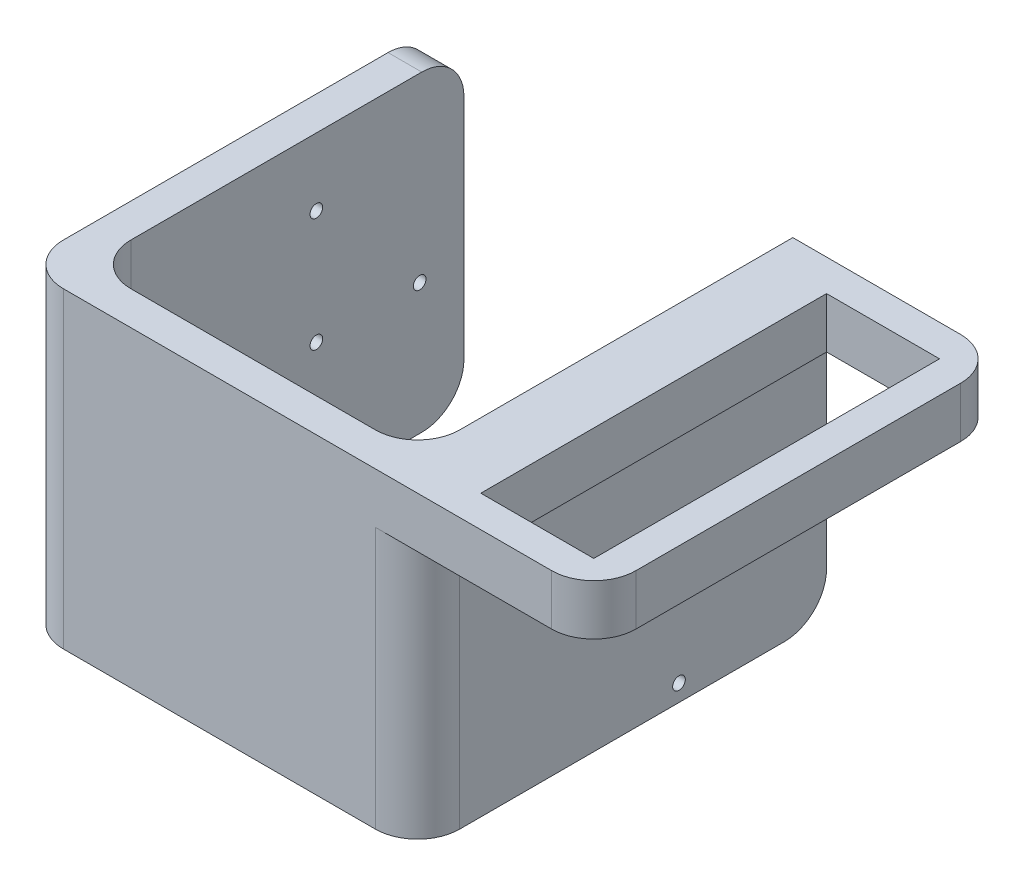
ISO-10303-21;
HEADER;
FILE_DESCRIPTION(('STEP AP214'),'2;1');
FILE_NAME('part.step','',(''),(''),'','','');
FILE_SCHEMA(('AUTOMOTIVE_DESIGN { 1 0 10303 214 1 1 1 1 }'));
ENDSEC;
DATA;
#1=APPLICATION_CONTEXT('core data for automotive mechanical design processes');
#2=APPLICATION_PROTOCOL_DEFINITION('international standard','automotive_design',2000,#1);
#3=PRODUCT_CONTEXT('',#1,'mechanical');
#4=PRODUCT('Part','Part','',(#3));
#5=PRODUCT_RELATED_PRODUCT_CATEGORY('part','',(#4));
#6=PRODUCT_DEFINITION_FORMATION('','',#4);
#7=PRODUCT_DEFINITION_CONTEXT('part definition',#1,'design');
#8=PRODUCT_DEFINITION('design','',#6,#7);
#9=PRODUCT_DEFINITION_SHAPE('','',#8);
#10=(LENGTH_UNIT() NAMED_UNIT(*) SI_UNIT(.MILLI.,.METRE.));
#11=(NAMED_UNIT(*) PLANE_ANGLE_UNIT() SI_UNIT($,.RADIAN.));
#12=(NAMED_UNIT(*) SI_UNIT($,.STERADIAN.) SOLID_ANGLE_UNIT());
#13=UNCERTAINTY_MEASURE_WITH_UNIT(LENGTH_MEASURE(1.E-05),#10,'distance_accuracy_value','');
#14=(GEOMETRIC_REPRESENTATION_CONTEXT(3) GLOBAL_UNCERTAINTY_ASSIGNED_CONTEXT((#13)) GLOBAL_UNIT_ASSIGNED_CONTEXT((#10,
#11,#12)) REPRESENTATION_CONTEXT('',''));
#15=CARTESIAN_POINT('',(0.,0.,0.));
#16=DIRECTION('',(0.,0.,1.));
#17=DIRECTION('',(1.,0.,0.));
#18=AXIS2_PLACEMENT_3D('',#15,#16,#17);
#19=CARTESIAN_POINT('',(47.,37.,8.));
#20=DIRECTION('',(-1.,0.,0.));
#21=DIRECTION('',(0.,-1.,0.));
#22=AXIS2_PLACEMENT_3D('',#19,#20,#21);
#23=PLANE('',#22);
#24=CARTESIAN_POINT('',(47.,-6.,-54.));
#25=DIRECTION('',(1.,0.,0.));
#26=DIRECTION('',(0.,1.,0.));
#27=AXIS2_PLACEMENT_3D('',#24,#25,#26);
#28=CIRCLE('',#27,1.5);
#29=CARTESIAN_POINT('',(47.,-4.5,-54.));
#30=VERTEX_POINT('',#29);
#31=EDGE_CURVE('E358',#30,#30,#28,.T.);
#32=ORIENTED_EDGE('',*,*,#31,.F.);
#33=EDGE_LOOP('',(#32));
#34=FACE_BOUND('',#33,.T.);
#35=CARTESIAN_POINT('',(47.,-33.,-54.));
#36=DIRECTION('',(1.,0.,0.));
#37=DIRECTION('',(0.,1.,0.));
#38=AXIS2_PLACEMENT_3D('',#35,#36,#37);
#39=CIRCLE('',#38,1.5);
#40=CARTESIAN_POINT('',(47.,-31.5,-54.));
#41=VERTEX_POINT('',#40);
#42=EDGE_CURVE('E354',#41,#41,#39,.T.);
#43=ORIENTED_EDGE('',*,*,#42,.F.);
#44=EDGE_LOOP('',(#43));
#45=FACE_BOUND('',#44,.T.);
#46=CARTESIAN_POINT('',(47.,-6.,-78.5));
#47=DIRECTION('',(1.,0.,0.));
#48=DIRECTION('',(0.,1.,0.));
#49=AXIS2_PLACEMENT_3D('',#46,#47,#48);
#50=CIRCLE('',#49,1.5);
#51=CARTESIAN_POINT('',(47.,-4.50000000000001,-78.5));
#52=VERTEX_POINT('',#51);
#53=EDGE_CURVE('E350',#52,#52,#50,.T.);
#54=ORIENTED_EDGE('',*,*,#53,.F.);
#55=EDGE_LOOP('',(#54));
#56=FACE_BOUND('',#55,.T.);
#57=CARTESIAN_POINT('',(47.,-6.,-29.5));
#58=DIRECTION('',(1.,0.,0.));
#59=DIRECTION('',(0.,1.,0.));
#60=AXIS2_PLACEMENT_3D('',#57,#58,#59);
#61=CIRCLE('',#60,1.5);
#62=CARTESIAN_POINT('',(47.,-4.5,-29.5));
#63=VERTEX_POINT('',#62);
#64=EDGE_CURVE('E345',#63,#63,#61,.T.);
#65=ORIENTED_EDGE('',*,*,#64,.F.);
#66=EDGE_LOOP('',(#65));
#67=FACE_BOUND('',#66,.T.);
#68=CARTESIAN_POINT('',(47.,21.,-54.));
#69=DIRECTION('',(1.,0.,0.));
#70=DIRECTION('',(0.,1.,0.));
#71=AXIS2_PLACEMENT_3D('',#68,#69,#70);
#72=CIRCLE('',#71,1.5);
#73=CARTESIAN_POINT('',(47.,22.5,-54.));
#74=VERTEX_POINT('',#73);
#75=EDGE_CURVE('E340',#74,#74,#72,.T.);
#76=ORIENTED_EDGE('',*,*,#75,.F.);
#77=EDGE_LOOP('',(#76));
#78=FACE_BOUND('',#77,.T.);
#79=DIRECTION('',(0.,0.,-1.));
#80=VECTOR('',#79,1.);
#81=CARTESIAN_POINT('',(47.,-37.,8.));
#82=LINE('',#81,#80);
#83=CARTESIAN_POINT('',(47.,-37.,-2.));
#84=VERTEX_POINT('',#83);
#85=CARTESIAN_POINT('',(47.,-37.,-79.));
#86=VERTEX_POINT('',#85);
#87=EDGE_CURVE('E450',#84,#86,#82,.T.);
#88=ORIENTED_EDGE('',*,*,#87,.T.);
#89=CARTESIAN_POINT('',(47.,-27.,-79.));
#90=DIRECTION('',(-1.,0.,0.));
#91=DIRECTION('',(0.,-1.,0.));
#92=AXIS2_PLACEMENT_3D('',#89,#90,#91);
#93=CIRCLE('',#92,10.);
#94=CARTESIAN_POINT('',(47.,-27.,-89.));
#95=VERTEX_POINT('',#94);
#96=EDGE_CURVE('E318',#86,#95,#93,.F.);
#97=ORIENTED_EDGE('',*,*,#96,.T.);
#98=DIRECTION('',(0.,-1.,0.));
#99=VECTOR('',#98,1.);
#100=CARTESIAN_POINT('',(47.,37.,-89.));
#101=LINE('',#100,#99);
#102=CARTESIAN_POINT('',(47.,25.,-89.));
#103=VERTEX_POINT('',#102);
#104=EDGE_CURVE('E276',#103,#95,#101,.T.);
#105=ORIENTED_EDGE('',*,*,#104,.F.);
#106=DIRECTION('',(0.,0.,-1.));
#107=VECTOR('',#106,1.);
#108=CARTESIAN_POINT('',(47.,25.,8.));
#109=LINE('',#108,#107);
#110=CARTESIAN_POINT('',(47.,25.,-2.));
#111=VERTEX_POINT('',#110);
#112=EDGE_CURVE('E231',#111,#103,#109,.T.);
#113=ORIENTED_EDGE('',*,*,#112,.F.);
#114=DIRECTION('',(0.,1.,0.));
#115=VECTOR('',#114,1.);
#116=CARTESIAN_POINT('',(47.,-37.,-2.));
#117=LINE('',#116,#115);
#118=EDGE_CURVE('E248',#111,#84,#117,.F.);
#119=ORIENTED_EDGE('',*,*,#118,.T.);
#120=EDGE_LOOP('',(#88,#97,#105,#113,#119));
#121=FACE_BOUND('',#120,.T.);
#122=ADVANCED_FACE('F33',(#34,#45,#56,#67,#78,#121),#23,.F.);
#123=CARTESIAN_POINT('',(0.,0.,0.));
#124=DIRECTION('',(0.,0.,1.));
#125=DIRECTION('',(1.,0.,0.));
#126=AXIS2_PLACEMENT_3D('',#123,#124,#125);
#127=PLANE('',#126);
#128=DIRECTION('',(-1.,0.,0.));
#129=VECTOR('',#128,1.);
#130=CARTESIAN_POINT('',(-47.,37.,0.));
#131=LINE('',#130,#129);
#132=CARTESIAN_POINT('',(29.,37.,0.));
#133=VERTEX_POINT('',#132);
#134=CARTESIAN_POINT('',(-29.,37.,0.));
#135=VERTEX_POINT('',#134);
#136=EDGE_CURVE('E266',#133,#135,#131,.T.);
#137=ORIENTED_EDGE('',*,*,#136,.F.);
#138=DIRECTION('',(0.,1.,0.));
#139=VECTOR('',#138,1.);
#140=CARTESIAN_POINT('',(29.,-37.,0.));
#141=LINE('',#140,#139);
#142=CARTESIAN_POINT('',(29.,-37.,0.));
#143=VERTEX_POINT('',#142);
#144=EDGE_CURVE('E54',#133,#143,#141,.F.);
#145=ORIENTED_EDGE('',*,*,#144,.T.);
#146=DIRECTION('',(1.,0.,0.));
#147=VECTOR('',#146,1.);
#148=CARTESIAN_POINT('',(-47.,-37.,0.));
#149=LINE('',#148,#147);
#150=CARTESIAN_POINT('',(-29.,-37.,0.));
#151=VERTEX_POINT('',#150);
#152=EDGE_CURVE('E440',#151,#143,#149,.T.);
#153=ORIENTED_EDGE('',*,*,#152,.F.);
#154=DIRECTION('',(0.,-1.,0.));
#155=VECTOR('',#154,1.);
#156=CARTESIAN_POINT('',(-29.,37.,0.));
#157=LINE('',#156,#155);
#158=EDGE_CURVE('E439',#151,#135,#157,.F.);
#159=ORIENTED_EDGE('',*,*,#158,.T.);
#160=EDGE_LOOP('',(#137,#145,#153,#159));
#161=FACE_BOUND('',#160,.T.);
#162=ADVANCED_FACE('F407',(#161),#127,.F.);
#163=CARTESIAN_POINT('',(-47.,37.,8.));
#164=DIRECTION('',(0.,-1.,0.));
#165=DIRECTION('',(0.,0.,-1.));
#166=AXIS2_PLACEMENT_3D('',#163,#164,#165);
#167=PLANE('',#166);
#168=DIRECTION('',(1.,0.,0.));
#169=VECTOR('',#168,1.);
#170=CARTESIAN_POINT('',(-47.,37.,-81.5));
#171=LINE('',#170,#169);
#172=CARTESIAN_POINT('',(54.5,37.,-81.5));
#173=VERTEX_POINT('',#172);
#174=CARTESIAN_POINT('',(81.3,37.,-81.5));
#175=VERTEX_POINT('',#174);
#176=EDGE_CURVE('E225',#173,#175,#171,.T.);
#177=ORIENTED_EDGE('',*,*,#176,.T.);
#178=DIRECTION('',(0.,0.,1.));
#179=VECTOR('',#178,1.);
#180=CARTESIAN_POINT('',(81.3,37.,8.00000000000002));
#181=LINE('',#180,#179);
#182=CARTESIAN_POINT('',(81.3,37.,0.500000000000014));
#183=VERTEX_POINT('',#182);
#184=EDGE_CURVE('E228',#175,#183,#181,.T.);
#185=ORIENTED_EDGE('',*,*,#184,.T.);
#186=DIRECTION('',(-1.,0.,0.));
#187=VECTOR('',#186,1.);
#188=CARTESIAN_POINT('',(-47.,37.,0.500000000000014));
#189=LINE('',#188,#187);
#190=CARTESIAN_POINT('',(54.5,37.,0.500000000000014));
#191=VERTEX_POINT('',#190);
#192=EDGE_CURVE('E220',#183,#191,#189,.T.);
#193=ORIENTED_EDGE('',*,*,#192,.T.);
#194=DIRECTION('',(0.,0.,-1.));
#195=VECTOR('',#194,1.);
#196=CARTESIAN_POINT('',(54.5,37.,8.00000000000001));
#197=LINE('',#196,#195);
#198=EDGE_CURVE('E195',#191,#173,#197,.T.);
#199=ORIENTED_EDGE('',*,*,#198,.T.);
#200=EDGE_LOOP('',(#177,#185,#193,#199));
#201=FACE_BOUND('',#200,.T.);
#202=DIRECTION('',(0.,0.,1.));
#203=VECTOR('',#202,1.);
#204=CARTESIAN_POINT('',(88.8,37.,8.));
#205=LINE('',#204,#203);
#206=CARTESIAN_POINT('',(88.8,37.,-79.));
#207=VERTEX_POINT('',#206);
#208=CARTESIAN_POINT('',(88.8,37.,-2.));
#209=VERTEX_POINT('',#208);
#210=EDGE_CURVE('E235',#207,#209,#205,.T.);
#211=ORIENTED_EDGE('',*,*,#210,.F.);
#212=CARTESIAN_POINT('',(78.8,37.,-79.));
#213=DIRECTION('',(0.,-1.,0.));
#214=DIRECTION('',(0.,0.,-1.));
#215=AXIS2_PLACEMENT_3D('',#212,#213,#214);
#216=CIRCLE('',#215,10.);
#217=CARTESIAN_POINT('',(78.8,37.,-89.));
#218=VERTEX_POINT('',#217);
#219=EDGE_CURVE('E412',#207,#218,#216,.F.);
#220=ORIENTED_EDGE('',*,*,#219,.T.);
#221=DIRECTION('',(1.,0.,0.));
#222=VECTOR('',#221,1.);
#223=CARTESIAN_POINT('',(47.,37.,-89.));
#224=LINE('',#223,#222);
#225=CARTESIAN_POINT('',(39.,37.,-89.));
#226=VERTEX_POINT('',#225);
#227=EDGE_CURVE('E323',#226,#218,#224,.T.);
#228=ORIENTED_EDGE('',*,*,#227,.F.);
#229=DIRECTION('',(0.,0.,1.));
#230=VECTOR('',#229,1.);
#231=CARTESIAN_POINT('',(39.,37.,-89.));
#232=LINE('',#231,#230);
#233=CARTESIAN_POINT('',(39.,37.,-9.99999999999999));
#234=VERTEX_POINT('',#233);
#235=EDGE_CURVE('E473',#226,#234,#232,.T.);
#236=ORIENTED_EDGE('',*,*,#235,.T.);
#237=CARTESIAN_POINT('',(29.,37.,-9.99999999999999));
#238=DIRECTION('',(0.,-1.,0.));
#239=DIRECTION('',(0.,0.,-1.));
#240=AXIS2_PLACEMENT_3D('',#237,#238,#239);
#241=CIRCLE('',#240,10.);
#242=EDGE_CURVE('E41',#234,#133,#241,.T.);
#243=ORIENTED_EDGE('',*,*,#242,.T.);
#244=ORIENTED_EDGE('',*,*,#136,.T.);
#245=CARTESIAN_POINT('',(-29.,37.,-9.99999999999999));
#246=DIRECTION('',(0.,-1.,0.));
#247=DIRECTION('',(0.,0.,-1.));
#248=AXIS2_PLACEMENT_3D('',#245,#246,#247);
#249=CIRCLE('',#248,10.);
#250=CARTESIAN_POINT('',(-39.,37.,-9.99999999999999));
#251=VERTEX_POINT('',#250);
#252=EDGE_CURVE('E672',#135,#251,#249,.T.);
#253=ORIENTED_EDGE('',*,*,#252,.T.);
#254=DIRECTION('',(0.,0.,1.));
#255=VECTOR('',#254,1.);
#256=CARTESIAN_POINT('',(-39.,37.,-89.));
#257=LINE('',#256,#255);
#258=CARTESIAN_POINT('',(-39.,37.,-79.));
#259=VERTEX_POINT('',#258);
#260=EDGE_CURVE('E267',#259,#251,#257,.T.);
#261=ORIENTED_EDGE('',*,*,#260,.F.);
#262=DIRECTION('',(1.,0.,0.));
#263=VECTOR('',#262,1.);
#264=CARTESIAN_POINT('',(-47.,37.,-79.));
#265=LINE('',#264,#263);
#266=CARTESIAN_POINT('',(-47.,37.,-79.));
#267=VERTEX_POINT('',#266);
#268=EDGE_CURVE('E287',#259,#267,#265,.F.);
#269=ORIENTED_EDGE('',*,*,#268,.T.);
#270=DIRECTION('',(0.,0.,-1.));
#271=VECTOR('',#270,1.);
#272=CARTESIAN_POINT('',(-47.,37.,8.));
#273=LINE('',#272,#271);
#274=CARTESIAN_POINT('',(-47.,37.,-2.));
#275=VERTEX_POINT('',#274);
#276=EDGE_CURVE('E272',#275,#267,#273,.T.);
#277=ORIENTED_EDGE('',*,*,#276,.F.);
#278=CARTESIAN_POINT('',(-37.,37.,-2.));
#279=DIRECTION('',(0.,-1.,0.));
#280=DIRECTION('',(0.,0.,-1.));
#281=AXIS2_PLACEMENT_3D('',#278,#279,#280);
#282=CIRCLE('',#281,10.);
#283=CARTESIAN_POINT('',(-37.,37.,8.));
#284=VERTEX_POINT('',#283);
#285=EDGE_CURVE('E481',#275,#284,#282,.F.);
#286=ORIENTED_EDGE('',*,*,#285,.T.);
#287=DIRECTION('',(-1.,0.,0.));
#288=VECTOR('',#287,1.);
#289=CARTESIAN_POINT('',(-47.,37.,8.));
#290=LINE('',#289,#288);
#291=CARTESIAN_POINT('',(78.8,37.,8.));
#292=VERTEX_POINT('',#291);
#293=EDGE_CURVE('E443',#292,#284,#290,.T.);
#294=ORIENTED_EDGE('',*,*,#293,.F.);
#295=CARTESIAN_POINT('',(78.8,37.,-2.));
#296=DIRECTION('',(0.,-1.,0.));
#297=DIRECTION('',(0.,0.,-1.));
#298=AXIS2_PLACEMENT_3D('',#295,#296,#297);
#299=CIRCLE('',#298,10.);
#300=EDGE_CURVE('E416',#292,#209,#299,.F.);
#301=ORIENTED_EDGE('',*,*,#300,.T.);
#302=EDGE_LOOP('',(#211,#220,#228,#236,#243,#244,#253,#261,#269,#277,#286,#294,#301));
#303=FACE_BOUND('',#302,.T.);
#304=ADVANCED_FACE('F404',(#201,#303),#167,.F.);
#305=CARTESIAN_POINT('',(-47.,37.,8.));
#306=DIRECTION('',(1.,0.,0.));
#307=DIRECTION('',(0.,1.,0.));
#308=AXIS2_PLACEMENT_3D('',#305,#306,#307);
#309=PLANE('',#308);
#310=CARTESIAN_POINT('',(-47.,-6.00000000000001,-54.));
#311=DIRECTION('',(1.,0.,0.));
#312=DIRECTION('',(0.,1.,0.));
#313=AXIS2_PLACEMENT_3D('',#310,#311,#312);
#314=CIRCLE('',#313,1.5);
#315=CARTESIAN_POINT('',(-47.,-4.50000000000001,-54.));
#316=VERTEX_POINT('',#315);
#317=EDGE_CURVE('E362',#316,#316,#314,.T.);
#318=ORIENTED_EDGE('',*,*,#317,.T.);
#319=EDGE_LOOP('',(#318));
#320=FACE_BOUND('',#319,.T.);
#321=CARTESIAN_POINT('',(-47.,-33.,-54.));
#322=DIRECTION('',(1.,0.,0.));
#323=DIRECTION('',(0.,1.,0.));
#324=AXIS2_PLACEMENT_3D('',#321,#322,#323);
#325=CIRCLE('',#324,1.5);
#326=CARTESIAN_POINT('',(-47.,-31.5,-54.));
#327=VERTEX_POINT('',#326);
#328=EDGE_CURVE('E375',#327,#327,#325,.T.);
#329=ORIENTED_EDGE('',*,*,#328,.T.);
#330=EDGE_LOOP('',(#329));
#331=FACE_BOUND('',#330,.T.);
#332=CARTESIAN_POINT('',(-47.,-6.00000000000001,-78.5));
#333=DIRECTION('',(1.,0.,0.));
#334=DIRECTION('',(0.,1.,0.));
#335=AXIS2_PLACEMENT_3D('',#332,#333,#334);
#336=CIRCLE('',#335,1.5);
#337=CARTESIAN_POINT('',(-47.,-4.50000000000002,-78.5));
#338=VERTEX_POINT('',#337);
#339=EDGE_CURVE('E382',#338,#338,#336,.T.);
#340=ORIENTED_EDGE('',*,*,#339,.T.);
#341=EDGE_LOOP('',(#340));
#342=FACE_BOUND('',#341,.T.);
#343=CARTESIAN_POINT('',(-47.,-6.00000000000001,-29.5));
#344=DIRECTION('',(1.,0.,0.));
#345=DIRECTION('',(0.,1.,0.));
#346=AXIS2_PLACEMENT_3D('',#343,#344,#345);
#347=CIRCLE('',#346,1.5);
#348=CARTESIAN_POINT('',(-47.,-4.50000000000001,-29.5));
#349=VERTEX_POINT('',#348);
#350=EDGE_CURVE('E389',#349,#349,#347,.T.);
#351=ORIENTED_EDGE('',*,*,#350,.T.);
#352=EDGE_LOOP('',(#351));
#353=FACE_BOUND('',#352,.T.);
#354=CARTESIAN_POINT('',(-47.,21.,-54.));
#355=DIRECTION('',(1.,0.,0.));
#356=DIRECTION('',(0.,1.,0.));
#357=AXIS2_PLACEMENT_3D('',#354,#355,#356);
#358=CIRCLE('',#357,1.5);
#359=CARTESIAN_POINT('',(-47.,22.5,-54.));
#360=VERTEX_POINT('',#359);
#361=EDGE_CURVE('E396',#360,#360,#358,.T.);
#362=ORIENTED_EDGE('',*,*,#361,.T.);
#363=EDGE_LOOP('',(#362));
#364=FACE_BOUND('',#363,.T.);
#365=DIRECTION('',(0.,0.,-1.));
#366=VECTOR('',#365,1.);
#367=CARTESIAN_POINT('',(-47.,-37.,8.));
#368=LINE('',#367,#366);
#369=CARTESIAN_POINT('',(-47.,-37.,-2.));
#370=VERTEX_POINT('',#369);
#371=CARTESIAN_POINT('',(-47.,-37.,-79.));
#372=VERTEX_POINT('',#371);
#373=EDGE_CURVE('E451',#370,#372,#368,.T.);
#374=ORIENTED_EDGE('',*,*,#373,.F.);
#375=DIRECTION('',(0.,-1.,0.));
#376=VECTOR('',#375,1.);
#377=CARTESIAN_POINT('',(-47.,37.,-2.));
#378=LINE('',#377,#376);
#379=EDGE_CURVE('E484',#370,#275,#378,.F.);
#380=ORIENTED_EDGE('',*,*,#379,.T.);
#381=ORIENTED_EDGE('',*,*,#276,.T.);
#382=CARTESIAN_POINT('',(-47.,27.,-79.));
#383=DIRECTION('',(1.,0.,0.));
#384=DIRECTION('',(0.,1.,0.));
#385=AXIS2_PLACEMENT_3D('',#382,#383,#384);
#386=CIRCLE('',#385,10.);
#387=CARTESIAN_POINT('',(-47.,27.,-89.));
#388=VERTEX_POINT('',#387);
#389=EDGE_CURVE('E289',#267,#388,#386,.F.);
#390=ORIENTED_EDGE('',*,*,#389,.T.);
#391=DIRECTION('',(0.,1.,0.));
#392=VECTOR('',#391,1.);
#393=CARTESIAN_POINT('',(-47.,37.,-89.));
#394=LINE('',#393,#392);
#395=CARTESIAN_POINT('',(-47.,-27.,-89.));
#396=VERTEX_POINT('',#395);
#397=EDGE_CURVE('E282',#396,#388,#394,.T.);
#398=ORIENTED_EDGE('',*,*,#397,.F.);
#399=CARTESIAN_POINT('',(-47.,-27.,-79.));
#400=DIRECTION('',(1.,0.,0.));
#401=DIRECTION('',(0.,1.,0.));
#402=AXIS2_PLACEMENT_3D('',#399,#400,#401);
#403=CIRCLE('',#402,10.);
#404=EDGE_CURVE('E258',#396,#372,#403,.F.);
#405=ORIENTED_EDGE('',*,*,#404,.T.);
#406=EDGE_LOOP('',(#374,#380,#381,#390,#398,#405));
#407=FACE_BOUND('',#406,.T.);
#408=ADVANCED_FACE('F406',(#320,#331,#342,#353,#364,#407),#309,.F.);
#409=CARTESIAN_POINT('',(-47.,-37.,8.));
#410=DIRECTION('',(0.,1.,0.));
#411=DIRECTION('',(0.,0.,1.));
#412=AXIS2_PLACEMENT_3D('',#409,#410,#411);
#413=PLANE('',#412);
#414=DIRECTION('',(1.,0.,0.));
#415=VECTOR('',#414,1.);
#416=CARTESIAN_POINT('',(-47.,-37.,8.));
#417=LINE('',#416,#415);
#418=CARTESIAN_POINT('',(-37.,-37.,8.));
#419=VERTEX_POINT('',#418);
#420=CARTESIAN_POINT('',(37.,-37.,8.));
#421=VERTEX_POINT('',#420);
#422=EDGE_CURVE('E304',#419,#421,#417,.T.);
#423=ORIENTED_EDGE('',*,*,#422,.F.);
#424=CARTESIAN_POINT('',(-37.,-37.,-2.));
#425=DIRECTION('',(0.,1.,0.));
#426=DIRECTION('',(0.,0.,1.));
#427=AXIS2_PLACEMENT_3D('',#424,#425,#426);
#428=CIRCLE('',#427,10.);
#429=EDGE_CURVE('E486',#419,#370,#428,.F.);
#430=ORIENTED_EDGE('',*,*,#429,.T.);
#431=ORIENTED_EDGE('',*,*,#373,.T.);
#432=DIRECTION('',(-1.,0.,0.));
#433=VECTOR('',#432,1.);
#434=CARTESIAN_POINT('',(-39.,-37.,-79.));
#435=LINE('',#434,#433);
#436=CARTESIAN_POINT('',(-39.,-37.,-79.));
#437=VERTEX_POINT('',#436);
#438=EDGE_CURVE('E261',#372,#437,#435,.F.);
#439=ORIENTED_EDGE('',*,*,#438,.T.);
#440=DIRECTION('',(0.,0.,1.));
#441=VECTOR('',#440,1.);
#442=CARTESIAN_POINT('',(-39.,-37.,-89.));
#443=LINE('',#442,#441);
#444=CARTESIAN_POINT('',(-39.,-37.,-9.99999999999999));
#445=VERTEX_POINT('',#444);
#446=EDGE_CURVE('E262',#437,#445,#443,.T.);
#447=ORIENTED_EDGE('',*,*,#446,.T.);
#448=CARTESIAN_POINT('',(-29.,-37.,-9.99999999999999));
#449=DIRECTION('',(0.,1.,0.));
#450=DIRECTION('',(0.,0.,1.));
#451=AXIS2_PLACEMENT_3D('',#448,#449,#450);
#452=CIRCLE('',#451,10.);
#453=EDGE_CURVE('E667',#445,#151,#452,.T.);
#454=ORIENTED_EDGE('',*,*,#453,.T.);
#455=ORIENTED_EDGE('',*,*,#152,.T.);
#456=CARTESIAN_POINT('',(29.,-37.,-9.99999999999999));
#457=DIRECTION('',(0.,1.,0.));
#458=DIRECTION('',(0.,0.,1.));
#459=AXIS2_PLACEMENT_3D('',#456,#457,#458);
#460=CIRCLE('',#459,10.);
#461=CARTESIAN_POINT('',(39.,-37.,-9.99999999999999));
#462=VERTEX_POINT('',#461);
#463=EDGE_CURVE('E11',#143,#462,#460,.T.);
#464=ORIENTED_EDGE('',*,*,#463,.T.);
#465=DIRECTION('',(0.,0.,1.));
#466=VECTOR('',#465,1.);
#467=CARTESIAN_POINT('',(39.,-37.,-89.));
#468=LINE('',#467,#466);
#469=CARTESIAN_POINT('',(39.,-37.,-79.));
#470=VERTEX_POINT('',#469);
#471=EDGE_CURVE('E469',#470,#462,#468,.T.);
#472=ORIENTED_EDGE('',*,*,#471,.F.);
#473=DIRECTION('',(-1.,0.,0.));
#474=VECTOR('',#473,1.);
#475=CARTESIAN_POINT('',(47.,-37.,-79.));
#476=LINE('',#475,#474);
#477=EDGE_CURVE('E489',#470,#86,#476,.F.);
#478=ORIENTED_EDGE('',*,*,#477,.T.);
#479=ORIENTED_EDGE('',*,*,#87,.F.);
#480=CARTESIAN_POINT('',(37.,-37.,-2.));
#481=DIRECTION('',(0.,1.,0.));
#482=DIRECTION('',(0.,0.,1.));
#483=AXIS2_PLACEMENT_3D('',#480,#481,#482);
#484=CIRCLE('',#483,10.);
#485=EDGE_CURVE('E250',#84,#421,#484,.F.);
#486=ORIENTED_EDGE('',*,*,#485,.T.);
#487=EDGE_LOOP('',(#423,#430,#431,#439,#447,#454,#455,#464,#472,#478,#479,#486));
#488=FACE_BOUND('',#487,.T.);
#489=ADVANCED_FACE('F502',(#488),#413,.F.);
#490=CARTESIAN_POINT('',(0.,0.,8.));
#491=DIRECTION('',(0.,0.,1.));
#492=DIRECTION('',(1.,0.,0.));
#493=AXIS2_PLACEMENT_3D('',#490,#491,#492);
#494=PLANE('',#493);
#495=DIRECTION('',(-1.,0.,0.));
#496=VECTOR('',#495,1.);
#497=CARTESIAN_POINT('',(88.8,25.,8.));
#498=LINE('',#497,#496);
#499=CARTESIAN_POINT('',(78.8,25.,8.));
#500=VERTEX_POINT('',#499);
#501=CARTESIAN_POINT('',(37.,25.,8.));
#502=VERTEX_POINT('',#501);
#503=EDGE_CURVE('E300',#500,#502,#498,.T.);
#504=ORIENTED_EDGE('',*,*,#503,.F.);
#505=DIRECTION('',(0.,-1.,0.));
#506=VECTOR('',#505,1.);
#507=CARTESIAN_POINT('',(78.8,0.,8.));
#508=LINE('',#507,#506);
#509=EDGE_CURVE('E430',#500,#292,#508,.F.);
#510=ORIENTED_EDGE('',*,*,#509,.T.);
#511=ORIENTED_EDGE('',*,*,#293,.T.);
#512=DIRECTION('',(0.,-1.,0.));
#513=VECTOR('',#512,1.);
#514=CARTESIAN_POINT('',(-37.,-37.,8.));
#515=LINE('',#514,#513);
#516=EDGE_CURVE('E479',#284,#419,#515,.T.);
#517=ORIENTED_EDGE('',*,*,#516,.T.);
#518=ORIENTED_EDGE('',*,*,#422,.T.);
#519=DIRECTION('',(0.,1.,0.));
#520=VECTOR('',#519,1.);
#521=CARTESIAN_POINT('',(37.,25.,8.));
#522=LINE('',#521,#520);
#523=EDGE_CURVE('E246',#421,#502,#522,.T.);
#524=ORIENTED_EDGE('',*,*,#523,.T.);
#525=EDGE_LOOP('',(#504,#510,#511,#517,#518,#524));
#526=FACE_BOUND('',#525,.T.);
#527=ADVANCED_FACE('F299',(#526),#494,.T.);
#528=CARTESIAN_POINT('',(-39.,37.,-89.));
#529=DIRECTION('',(-1.,0.,0.));
#530=DIRECTION('',(0.,-1.,0.));
#531=AXIS2_PLACEMENT_3D('',#528,#529,#530);
#532=PLANE('',#531);
#533=CARTESIAN_POINT('',(-39.,-6.00000000000001,-54.));
#534=DIRECTION('',(-1.,0.,0.));
#535=DIRECTION('',(0.,-1.,0.));
#536=AXIS2_PLACEMENT_3D('',#533,#534,#535);
#537=CIRCLE('',#536,1.5);
#538=CARTESIAN_POINT('',(-39.,-7.50000000000001,-54.));
#539=VERTEX_POINT('',#538);
#540=EDGE_CURVE('E357',#539,#539,#537,.T.);
#541=ORIENTED_EDGE('',*,*,#540,.T.);
#542=EDGE_LOOP('',(#541));
#543=FACE_BOUND('',#542,.T.);
#544=CARTESIAN_POINT('',(-39.,-33.,-54.));
#545=DIRECTION('',(-1.,0.,0.));
#546=DIRECTION('',(0.,-1.,0.));
#547=AXIS2_PLACEMENT_3D('',#544,#545,#546);
#548=CIRCLE('',#547,1.5);
#549=CARTESIAN_POINT('',(-39.,-34.5,-54.));
#550=VERTEX_POINT('',#549);
#551=EDGE_CURVE('E353',#550,#550,#548,.T.);
#552=ORIENTED_EDGE('',*,*,#551,.T.);
#553=EDGE_LOOP('',(#552));
#554=FACE_BOUND('',#553,.T.);
#555=CARTESIAN_POINT('',(-39.,-6.00000000000001,-78.5));
#556=DIRECTION('',(-1.,0.,0.));
#557=DIRECTION('',(0.,-1.,0.));
#558=AXIS2_PLACEMENT_3D('',#555,#556,#557);
#559=CIRCLE('',#558,1.5);
#560=CARTESIAN_POINT('',(-39.,-7.50000000000001,-78.5));
#561=VERTEX_POINT('',#560);
#562=EDGE_CURVE('E349',#561,#561,#559,.T.);
#563=ORIENTED_EDGE('',*,*,#562,.T.);
#564=EDGE_LOOP('',(#563));
#565=FACE_BOUND('',#564,.T.);
#566=CARTESIAN_POINT('',(-39.,-6.00000000000001,-29.5));
#567=DIRECTION('',(-1.,0.,0.));
#568=DIRECTION('',(0.,-1.,0.));
#569=AXIS2_PLACEMENT_3D('',#566,#567,#568);
#570=CIRCLE('',#569,1.5);
#571=CARTESIAN_POINT('',(-39.,-7.50000000000001,-29.5));
#572=VERTEX_POINT('',#571);
#573=EDGE_CURVE('E344',#572,#572,#570,.T.);
#574=ORIENTED_EDGE('',*,*,#573,.T.);
#575=EDGE_LOOP('',(#574));
#576=FACE_BOUND('',#575,.T.);
#577=CARTESIAN_POINT('',(-39.,21.,-54.));
#578=DIRECTION('',(-1.,0.,0.));
#579=DIRECTION('',(0.,-1.,0.));
#580=AXIS2_PLACEMENT_3D('',#577,#578,#579);
#581=CIRCLE('',#580,1.5);
#582=CARTESIAN_POINT('',(-39.,19.5,-54.));
#583=VERTEX_POINT('',#582);
#584=EDGE_CURVE('E339',#583,#583,#581,.T.);
#585=ORIENTED_EDGE('',*,*,#584,.T.);
#586=EDGE_LOOP('',(#585));
#587=FACE_BOUND('',#586,.T.);
#588=ORIENTED_EDGE('',*,*,#260,.T.);
#589=DIRECTION('',(0.,-1.,0.));
#590=VECTOR('',#589,1.);
#591=CARTESIAN_POINT('',(-39.,-37.,-9.99999999999999));
#592=LINE('',#591,#590);
#593=EDGE_CURVE('E436',#251,#445,#592,.T.);
#594=ORIENTED_EDGE('',*,*,#593,.T.);
#595=ORIENTED_EDGE('',*,*,#446,.F.);
#596=CARTESIAN_POINT('',(-39.,-27.,-79.));
#597=DIRECTION('',(-1.,0.,0.));
#598=DIRECTION('',(0.,-1.,0.));
#599=AXIS2_PLACEMENT_3D('',#596,#597,#598);
#600=CIRCLE('',#599,10.);
#601=CARTESIAN_POINT('',(-39.,-27.,-89.));
#602=VERTEX_POINT('',#601);
#603=EDGE_CURVE('E468',#437,#602,#600,.F.);
#604=ORIENTED_EDGE('',*,*,#603,.T.);
#605=DIRECTION('',(0.,-1.,0.));
#606=VECTOR('',#605,1.);
#607=CARTESIAN_POINT('',(-39.,37.,-89.));
#608=LINE('',#607,#606);
#609=CARTESIAN_POINT('',(-39.,27.,-89.));
#610=VERTEX_POINT('',#609);
#611=EDGE_CURVE('E460',#610,#602,#608,.T.);
#612=ORIENTED_EDGE('',*,*,#611,.F.);
#613=CARTESIAN_POINT('',(-39.,27.,-79.));
#614=DIRECTION('',(-1.,0.,0.));
#615=DIRECTION('',(0.,-1.,0.));
#616=AXIS2_PLACEMENT_3D('',#613,#614,#615);
#617=CIRCLE('',#616,10.);
#618=EDGE_CURVE('E285',#610,#259,#617,.F.);
#619=ORIENTED_EDGE('',*,*,#618,.T.);
#620=EDGE_LOOP('',(#588,#594,#595,#604,#612,#619));
#621=FACE_BOUND('',#620,.T.);
#622=ADVANCED_FACE('F464',(#543,#554,#565,#576,#587,#621),#532,.F.);
#623=CARTESIAN_POINT('',(0.,0.,-89.));
#624=DIRECTION('',(0.,0.,-1.));
#625=DIRECTION('',(-1.,0.,0.));
#626=AXIS2_PLACEMENT_3D('',#623,#624,#625);
#627=PLANE('',#626);
#628=ORIENTED_EDGE('',*,*,#611,.T.);
#629=DIRECTION('',(-1.,0.,0.));
#630=VECTOR('',#629,1.);
#631=CARTESIAN_POINT('',(-47.,-27.,-89.));
#632=LINE('',#631,#630);
#633=EDGE_CURVE('E255',#602,#396,#632,.T.);
#634=ORIENTED_EDGE('',*,*,#633,.T.);
#635=ORIENTED_EDGE('',*,*,#397,.T.);
#636=DIRECTION('',(1.,0.,0.));
#637=VECTOR('',#636,1.);
#638=CARTESIAN_POINT('',(-39.,27.,-89.));
#639=LINE('',#638,#637);
#640=EDGE_CURVE('E283',#388,#610,#639,.T.);
#641=ORIENTED_EDGE('',*,*,#640,.T.);
#642=EDGE_LOOP('',(#628,#634,#635,#641));
#643=FACE_BOUND('',#642,.T.);
#644=ADVANCED_FACE('F459',(#643),#627,.T.);
#645=CARTESIAN_POINT('',(39.,37.,-89.));
#646=DIRECTION('',(1.,0.,0.));
#647=DIRECTION('',(0.,1.,0.));
#648=AXIS2_PLACEMENT_3D('',#645,#646,#647);
#649=PLANE('',#648);
#650=CARTESIAN_POINT('',(39.,-6.,-54.));
#651=DIRECTION('',(1.,0.,0.));
#652=DIRECTION('',(0.,1.,0.));
#653=AXIS2_PLACEMENT_3D('',#650,#651,#652);
#654=CIRCLE('',#653,1.5);
#655=CARTESIAN_POINT('',(39.,-4.5,-54.));
#656=VERTEX_POINT('',#655);
#657=EDGE_CURVE('E355',#656,#656,#654,.T.);
#658=ORIENTED_EDGE('',*,*,#657,.T.);
#659=EDGE_LOOP('',(#658));
#660=FACE_BOUND('',#659,.T.);
#661=CARTESIAN_POINT('',(39.,-33.,-54.));
#662=DIRECTION('',(1.,0.,0.));
#663=DIRECTION('',(0.,1.,0.));
#664=AXIS2_PLACEMENT_3D('',#661,#662,#663);
#665=CIRCLE('',#664,1.5);
#666=CARTESIAN_POINT('',(39.,-31.5,-54.));
#667=VERTEX_POINT('',#666);
#668=EDGE_CURVE('E351',#667,#667,#665,.T.);
#669=ORIENTED_EDGE('',*,*,#668,.T.);
#670=EDGE_LOOP('',(#669));
#671=FACE_BOUND('',#670,.T.);
#672=CARTESIAN_POINT('',(39.,-6.00000000000001,-78.5));
#673=DIRECTION('',(1.,0.,0.));
#674=DIRECTION('',(0.,1.,0.));
#675=AXIS2_PLACEMENT_3D('',#672,#673,#674);
#676=CIRCLE('',#675,1.5);
#677=CARTESIAN_POINT('',(39.,-4.50000000000001,-78.5));
#678=VERTEX_POINT('',#677);
#679=EDGE_CURVE('E346',#678,#678,#676,.T.);
#680=ORIENTED_EDGE('',*,*,#679,.T.);
#681=EDGE_LOOP('',(#680));
#682=FACE_BOUND('',#681,.T.);
#683=CARTESIAN_POINT('',(39.,-6.,-29.5));
#684=DIRECTION('',(1.,0.,0.));
#685=DIRECTION('',(0.,1.,0.));
#686=AXIS2_PLACEMENT_3D('',#683,#684,#685);
#687=CIRCLE('',#686,1.5);
#688=CARTESIAN_POINT('',(39.,-4.5,-29.5));
#689=VERTEX_POINT('',#688);
#690=EDGE_CURVE('E341',#689,#689,#687,.T.);
#691=ORIENTED_EDGE('',*,*,#690,.T.);
#692=EDGE_LOOP('',(#691));
#693=FACE_BOUND('',#692,.T.);
#694=CARTESIAN_POINT('',(39.,21.,-54.));
#695=DIRECTION('',(1.,0.,0.));
#696=DIRECTION('',(0.,1.,0.));
#697=AXIS2_PLACEMENT_3D('',#694,#695,#696);
#698=CIRCLE('',#697,1.5);
#699=CARTESIAN_POINT('',(39.,22.5,-54.));
#700=VERTEX_POINT('',#699);
#701=EDGE_CURVE('E336',#700,#700,#698,.T.);
#702=ORIENTED_EDGE('',*,*,#701,.T.);
#703=EDGE_LOOP('',(#702));
#704=FACE_BOUND('',#703,.T.);
#705=ORIENTED_EDGE('',*,*,#471,.T.);
#706=DIRECTION('',(0.,1.,0.));
#707=VECTOR('',#706,1.);
#708=CARTESIAN_POINT('',(39.,37.,-9.99999999999999));
#709=LINE('',#708,#707);
#710=EDGE_CURVE('E512',#462,#234,#709,.T.);
#711=ORIENTED_EDGE('',*,*,#710,.T.);
#712=ORIENTED_EDGE('',*,*,#235,.F.);
#713=DIRECTION('',(0.,1.,0.));
#714=VECTOR('',#713,1.);
#715=CARTESIAN_POINT('',(39.,37.,-89.));
#716=LINE('',#715,#714);
#717=CARTESIAN_POINT('',(39.,-27.,-89.));
#718=VERTEX_POINT('',#717);
#719=EDGE_CURVE('E322',#718,#226,#716,.T.);
#720=ORIENTED_EDGE('',*,*,#719,.F.);
#721=CARTESIAN_POINT('',(39.,-27.,-79.));
#722=DIRECTION('',(1.,0.,0.));
#723=DIRECTION('',(0.,1.,0.));
#724=AXIS2_PLACEMENT_3D('',#721,#722,#723);
#725=CIRCLE('',#724,10.);
#726=EDGE_CURVE('E497',#718,#470,#725,.F.);
#727=ORIENTED_EDGE('',*,*,#726,.T.);
#728=EDGE_LOOP('',(#705,#711,#712,#720,#727));
#729=FACE_BOUND('',#728,.T.);
#730=ADVANCED_FACE('F509',(#660,#671,#682,#693,#704,#729),#649,.F.);
#731=CARTESIAN_POINT('',(0.,0.,-89.));
#732=DIRECTION('',(0.,0.,-1.));
#733=DIRECTION('',(-1.,0.,0.));
#734=AXIS2_PLACEMENT_3D('',#731,#732,#733);
#735=PLANE('',#734);
#736=ORIENTED_EDGE('',*,*,#227,.T.);
#737=DIRECTION('',(0.,1.,0.));
#738=VECTOR('',#737,1.);
#739=CARTESIAN_POINT('',(78.8,0.,-89.));
#740=LINE('',#739,#738);
#741=CARTESIAN_POINT('',(78.8,25.,-89.));
#742=VERTEX_POINT('',#741);
#743=EDGE_CURVE('E428',#218,#742,#740,.F.);
#744=ORIENTED_EDGE('',*,*,#743,.T.);
#745=DIRECTION('',(-1.,0.,0.));
#746=VECTOR('',#745,1.);
#747=CARTESIAN_POINT('',(88.8,25.,-89.));
#748=LINE('',#747,#746);
#749=EDGE_CURVE('E237',#742,#103,#748,.T.);
#750=ORIENTED_EDGE('',*,*,#749,.T.);
#751=ORIENTED_EDGE('',*,*,#104,.T.);
#752=DIRECTION('',(-1.,0.,0.));
#753=VECTOR('',#752,1.);
#754=CARTESIAN_POINT('',(39.,-27.,-89.));
#755=LINE('',#754,#753);
#756=EDGE_CURVE('E496',#95,#718,#755,.T.);
#757=ORIENTED_EDGE('',*,*,#756,.T.);
#758=ORIENTED_EDGE('',*,*,#719,.T.);
#759=EDGE_LOOP('',(#736,#744,#750,#751,#757,#758));
#760=FACE_BOUND('',#759,.T.);
#761=ADVANCED_FACE('F506',(#760),#735,.T.);
#762=CARTESIAN_POINT('',(88.8,25.,8.));
#763=DIRECTION('',(0.,1.,0.));
#764=DIRECTION('',(-1.,0.,0.));
#765=AXIS2_PLACEMENT_3D('',#762,#763,#764);
#766=PLANE('',#765);
#767=DIRECTION('',(-1.,0.,0.));
#768=VECTOR('',#767,1.);
#769=CARTESIAN_POINT('',(54.5,25.,0.500000000000014));
#770=LINE('',#769,#768);
#771=CARTESIAN_POINT('',(81.3,25.,0.500000000000014));
#772=VERTEX_POINT('',#771);
#773=CARTESIAN_POINT('',(54.5,25.,0.500000000000014));
#774=VERTEX_POINT('',#773);
#775=EDGE_CURVE('E203',#772,#774,#770,.T.);
#776=ORIENTED_EDGE('',*,*,#775,.F.);
#777=DIRECTION('',(0.,0.,1.));
#778=VECTOR('',#777,1.);
#779=CARTESIAN_POINT('',(81.3,25.,0.500000000000014));
#780=LINE('',#779,#778);
#781=CARTESIAN_POINT('',(81.3,25.,-81.5));
#782=VERTEX_POINT('',#781);
#783=EDGE_CURVE('E208',#782,#772,#780,.T.);
#784=ORIENTED_EDGE('',*,*,#783,.F.);
#785=DIRECTION('',(1.,0.,0.));
#786=VECTOR('',#785,1.);
#787=CARTESIAN_POINT('',(54.5,25.,-81.5));
#788=LINE('',#787,#786);
#789=CARTESIAN_POINT('',(54.5,25.,-81.5));
#790=VERTEX_POINT('',#789);
#791=EDGE_CURVE('E213',#790,#782,#788,.T.);
#792=ORIENTED_EDGE('',*,*,#791,.F.);
#793=DIRECTION('',(0.,0.,-1.));
#794=VECTOR('',#793,1.);
#795=CARTESIAN_POINT('',(54.5,25.,0.500000000000014));
#796=LINE('',#795,#794);
#797=EDGE_CURVE('E192',#774,#790,#796,.T.);
#798=ORIENTED_EDGE('',*,*,#797,.F.);
#799=EDGE_LOOP('',(#776,#784,#792,#798));
#800=FACE_BOUND('',#799,.T.);
#801=ORIENTED_EDGE('',*,*,#749,.F.);
#802=CARTESIAN_POINT('',(78.8,25.,-79.));
#803=DIRECTION('',(0.,1.,0.));
#804=DIRECTION('',(-1.,0.,0.));
#805=AXIS2_PLACEMENT_3D('',#802,#803,#804);
#806=CIRCLE('',#805,10.);
#807=CARTESIAN_POINT('',(88.8,25.,-79.));
#808=VERTEX_POINT('',#807);
#809=EDGE_CURVE('E434',#742,#808,#806,.F.);
#810=ORIENTED_EDGE('',*,*,#809,.T.);
#811=DIRECTION('',(0.,0.,-1.));
#812=VECTOR('',#811,1.);
#813=CARTESIAN_POINT('',(88.8,25.,8.));
#814=LINE('',#813,#812);
#815=CARTESIAN_POINT('',(88.8,25.,-2.));
#816=VERTEX_POINT('',#815);
#817=EDGE_CURVE('E232',#816,#808,#814,.T.);
#818=ORIENTED_EDGE('',*,*,#817,.F.);
#819=CARTESIAN_POINT('',(78.8,25.,-2.));
#820=DIRECTION('',(0.,1.,0.));
#821=DIRECTION('',(-1.,0.,0.));
#822=AXIS2_PLACEMENT_3D('',#819,#820,#821);
#823=CIRCLE('',#822,10.);
#824=EDGE_CURVE('E331',#816,#500,#823,.F.);
#825=ORIENTED_EDGE('',*,*,#824,.T.);
#826=ORIENTED_EDGE('',*,*,#503,.T.);
#827=CARTESIAN_POINT('',(37.,25.,-2.));
#828=DIRECTION('',(0.,1.,0.));
#829=DIRECTION('',(-1.,0.,0.));
#830=AXIS2_PLACEMENT_3D('',#827,#828,#829);
#831=CIRCLE('',#830,10.);
#832=EDGE_CURVE('E253',#502,#111,#831,.T.);
#833=ORIENTED_EDGE('',*,*,#832,.T.);
#834=ORIENTED_EDGE('',*,*,#112,.T.);
#835=EDGE_LOOP('',(#801,#810,#818,#825,#826,#833,#834));
#836=FACE_BOUND('',#835,.T.);
#837=ADVANCED_FACE('F210',(#800,#836),#766,.F.);
#838=CARTESIAN_POINT('',(88.8,0.,0.));
#839=DIRECTION('',(1.,0.,0.));
#840=DIRECTION('',(0.,1.,0.));
#841=AXIS2_PLACEMENT_3D('',#838,#839,#840);
#842=PLANE('',#841);
#843=ORIENTED_EDGE('',*,*,#817,.T.);
#844=DIRECTION('',(0.,1.,0.));
#845=VECTOR('',#844,1.);
#846=CARTESIAN_POINT('',(88.8,0.,-79.));
#847=LINE('',#846,#845);
#848=EDGE_CURVE('E424',#808,#207,#847,.T.);
#849=ORIENTED_EDGE('',*,*,#848,.T.);
#850=ORIENTED_EDGE('',*,*,#210,.T.);
#851=DIRECTION('',(0.,-1.,0.));
#852=VECTOR('',#851,1.);
#853=CARTESIAN_POINT('',(88.8,0.,-2.));
#854=LINE('',#853,#852);
#855=EDGE_CURVE('E329',#209,#816,#854,.T.);
#856=ORIENTED_EDGE('',*,*,#855,.T.);
#857=EDGE_LOOP('',(#843,#849,#850,#856));
#858=FACE_BOUND('',#857,.T.);
#859=ADVANCED_FACE('F421',(#858),#842,.T.);
#860=CARTESIAN_POINT('',(81.3,40.,0.500000000000014));
#861=DIRECTION('',(1.,0.,0.));
#862=DIRECTION('',(0.,0.,-1.));
#863=AXIS2_PLACEMENT_3D('',#860,#861,#862);
#864=PLANE('',#863);
#865=DIRECTION('',(0.,-1.,0.));
#866=VECTOR('',#865,1.);
#867=CARTESIAN_POINT('',(81.3,40.,-81.5));
#868=LINE('',#867,#866);
#869=EDGE_CURVE('E218',#175,#782,#868,.T.);
#870=ORIENTED_EDGE('',*,*,#869,.T.);
#871=ORIENTED_EDGE('',*,*,#783,.T.);
#872=DIRECTION('',(0.,-1.,0.));
#873=VECTOR('',#872,1.);
#874=CARTESIAN_POINT('',(81.3,40.,0.500000000000014));
#875=LINE('',#874,#873);
#876=EDGE_CURVE('E199',#183,#772,#875,.T.);
#877=ORIENTED_EDGE('',*,*,#876,.F.);
#878=ORIENTED_EDGE('',*,*,#184,.F.);
#879=EDGE_LOOP('',(#870,#871,#877,#878));
#880=FACE_BOUND('',#879,.T.);
#881=ADVANCED_FACE('F399',(#880),#864,.F.);
#882=CARTESIAN_POINT('',(54.5,40.,-81.5));
#883=DIRECTION('',(0.,0.,-1.));
#884=DIRECTION('',(-1.,0.,0.));
#885=AXIS2_PLACEMENT_3D('',#882,#883,#884);
#886=PLANE('',#885);
#887=DIRECTION('',(0.,-1.,0.));
#888=VECTOR('',#887,1.);
#889=CARTESIAN_POINT('',(54.5,40.,-81.5));
#890=LINE('',#889,#888);
#891=EDGE_CURVE('E198',#173,#790,#890,.T.);
#892=ORIENTED_EDGE('',*,*,#891,.T.);
#893=ORIENTED_EDGE('',*,*,#791,.T.);
#894=ORIENTED_EDGE('',*,*,#869,.F.);
#895=ORIENTED_EDGE('',*,*,#176,.F.);
#896=EDGE_LOOP('',(#892,#893,#894,#895));
#897=FACE_BOUND('',#896,.T.);
#898=ADVANCED_FACE('F402',(#897),#886,.F.);
#899=CARTESIAN_POINT('',(54.5,40.,0.500000000000014));
#900=DIRECTION('',(-1.,0.,0.));
#901=DIRECTION('',(0.,-1.,0.));
#902=AXIS2_PLACEMENT_3D('',#899,#900,#901);
#903=PLANE('',#902);
#904=DIRECTION('',(0.,-1.,0.));
#905=VECTOR('',#904,1.);
#906=CARTESIAN_POINT('',(54.5,40.,0.500000000000014));
#907=LINE('',#906,#905);
#908=EDGE_CURVE('E187',#191,#774,#907,.T.);
#909=ORIENTED_EDGE('',*,*,#908,.T.);
#910=ORIENTED_EDGE('',*,*,#797,.T.);
#911=ORIENTED_EDGE('',*,*,#891,.F.);
#912=ORIENTED_EDGE('',*,*,#198,.F.);
#913=EDGE_LOOP('',(#909,#910,#911,#912));
#914=FACE_BOUND('',#913,.T.);
#915=ADVANCED_FACE('F189',(#914),#903,.F.);
#916=CARTESIAN_POINT('',(54.5,40.,0.500000000000014));
#917=DIRECTION('',(0.,0.,1.));
#918=DIRECTION('',(1.,0.,0.));
#919=AXIS2_PLACEMENT_3D('',#916,#917,#918);
#920=PLANE('',#919);
#921=ORIENTED_EDGE('',*,*,#876,.T.);
#922=ORIENTED_EDGE('',*,*,#775,.T.);
#923=ORIENTED_EDGE('',*,*,#908,.F.);
#924=ORIENTED_EDGE('',*,*,#192,.F.);
#925=EDGE_LOOP('',(#921,#922,#923,#924));
#926=FACE_BOUND('',#925,.T.);
#927=ADVANCED_FACE('F204',(#926),#920,.F.);
#928=CARTESIAN_POINT('',(-53.,21.,-54.));
#929=DIRECTION('',(1.,0.,0.));
#930=DIRECTION('',(0.,1.,0.));
#931=AXIS2_PLACEMENT_3D('',#928,#929,#930);
#932=CYLINDRICAL_SURFACE('',#931,1.5);
#933=ORIENTED_EDGE('',*,*,#75,.T.);
#934=EDGE_LOOP('',(#933));
#935=FACE_BOUND('',#934,.T.);
#936=ORIENTED_EDGE('',*,*,#701,.F.);
#937=EDGE_LOOP('',(#936));
#938=FACE_BOUND('',#937,.T.);
#939=ADVANCED_FACE('F781',(#935,#938),#932,.F.);
#940=ORIENTED_EDGE('',*,*,#584,.F.);
#941=EDGE_LOOP('',(#940));
#942=FACE_BOUND('',#941,.T.);
#943=ORIENTED_EDGE('',*,*,#361,.F.);
#944=EDGE_LOOP('',(#943));
#945=FACE_BOUND('',#944,.T.);
#946=ADVANCED_FACE('F773',(#942,#945),#932,.F.);
#947=CARTESIAN_POINT('',(-53.,-6.00000000000001,-29.5));
#948=DIRECTION('',(1.,0.,0.));
#949=DIRECTION('',(0.,1.,0.));
#950=AXIS2_PLACEMENT_3D('',#947,#948,#949);
#951=CYLINDRICAL_SURFACE('',#950,1.5);
#952=ORIENTED_EDGE('',*,*,#64,.T.);
#953=EDGE_LOOP('',(#952));
#954=FACE_BOUND('',#953,.T.);
#955=ORIENTED_EDGE('',*,*,#690,.F.);
#956=EDGE_LOOP('',(#955));
#957=FACE_BOUND('',#956,.T.);
#958=ADVANCED_FACE('F764',(#954,#957),#951,.F.);
#959=ORIENTED_EDGE('',*,*,#573,.F.);
#960=EDGE_LOOP('',(#959));
#961=FACE_BOUND('',#960,.T.);
#962=ORIENTED_EDGE('',*,*,#350,.F.);
#963=EDGE_LOOP('',(#962));
#964=FACE_BOUND('',#963,.T.);
#965=ADVANCED_FACE('F756',(#961,#964),#951,.F.);
#966=CARTESIAN_POINT('',(-53.,-6.00000000000001,-78.5));
#967=DIRECTION('',(1.,0.,0.));
#968=DIRECTION('',(0.,1.,0.));
#969=AXIS2_PLACEMENT_3D('',#966,#967,#968);
#970=CYLINDRICAL_SURFACE('',#969,1.5);
#971=ORIENTED_EDGE('',*,*,#53,.T.);
#972=EDGE_LOOP('',(#971));
#973=FACE_BOUND('',#972,.T.);
#974=ORIENTED_EDGE('',*,*,#679,.F.);
#975=EDGE_LOOP('',(#974));
#976=FACE_BOUND('',#975,.T.);
#977=ADVANCED_FACE('F747',(#973,#976),#970,.F.);
#978=ORIENTED_EDGE('',*,*,#562,.F.);
#979=EDGE_LOOP('',(#978));
#980=FACE_BOUND('',#979,.T.);
#981=ORIENTED_EDGE('',*,*,#339,.F.);
#982=EDGE_LOOP('',(#981));
#983=FACE_BOUND('',#982,.T.);
#984=ADVANCED_FACE('F739',(#980,#983),#970,.F.);
#985=CARTESIAN_POINT('',(-53.,-33.,-54.));
#986=DIRECTION('',(1.,0.,0.));
#987=DIRECTION('',(0.,1.,0.));
#988=AXIS2_PLACEMENT_3D('',#985,#986,#987);
#989=CYLINDRICAL_SURFACE('',#988,1.5);
#990=ORIENTED_EDGE('',*,*,#42,.T.);
#991=EDGE_LOOP('',(#990));
#992=FACE_BOUND('',#991,.T.);
#993=ORIENTED_EDGE('',*,*,#668,.F.);
#994=EDGE_LOOP('',(#993));
#995=FACE_BOUND('',#994,.T.);
#996=ADVANCED_FACE('F730',(#992,#995),#989,.F.);
#997=ORIENTED_EDGE('',*,*,#551,.F.);
#998=EDGE_LOOP('',(#997));
#999=FACE_BOUND('',#998,.T.);
#1000=ORIENTED_EDGE('',*,*,#328,.F.);
#1001=EDGE_LOOP('',(#1000));
#1002=FACE_BOUND('',#1001,.T.);
#1003=ADVANCED_FACE('F723',(#999,#1002),#989,.F.);
#1004=CARTESIAN_POINT('',(-53.,-6.00000000000001,-54.));
#1005=DIRECTION('',(1.,0.,0.));
#1006=DIRECTION('',(0.,1.,0.));
#1007=AXIS2_PLACEMENT_3D('',#1004,#1005,#1006);
#1008=CYLINDRICAL_SURFACE('',#1007,1.5);
#1009=ORIENTED_EDGE('',*,*,#31,.T.);
#1010=EDGE_LOOP('',(#1009));
#1011=FACE_BOUND('',#1010,.T.);
#1012=ORIENTED_EDGE('',*,*,#657,.F.);
#1013=EDGE_LOOP('',(#1012));
#1014=FACE_BOUND('',#1013,.T.);
#1015=ADVANCED_FACE('F714',(#1011,#1014),#1008,.F.);
#1016=ORIENTED_EDGE('',*,*,#540,.F.);
#1017=EDGE_LOOP('',(#1016));
#1018=FACE_BOUND('',#1017,.T.);
#1019=ORIENTED_EDGE('',*,*,#317,.F.);
#1020=EDGE_LOOP('',(#1019));
#1021=FACE_BOUND('',#1020,.T.);
#1022=ADVANCED_FACE('F540',(#1018,#1021),#1008,.F.);
#1023=CARTESIAN_POINT('',(0.,27.,-79.));
#1024=DIRECTION('',(-1.,0.,0.));
#1025=DIRECTION('',(0.,0.,1.));
#1026=AXIS2_PLACEMENT_3D('',#1023,#1024,#1025);
#1027=CYLINDRICAL_SURFACE('',#1026,10.);
#1028=ORIENTED_EDGE('',*,*,#389,.F.);
#1029=ORIENTED_EDGE('',*,*,#268,.F.);
#1030=ORIENTED_EDGE('',*,*,#618,.F.);
#1031=ORIENTED_EDGE('',*,*,#640,.F.);
#1032=EDGE_LOOP('',(#1028,#1029,#1030,#1031));
#1033=FACE_BOUND('',#1032,.T.);
#1034=ADVANCED_FACE('F537',(#1033),#1027,.T.);
#1035=CARTESIAN_POINT('',(37.,0.,-2.));
#1036=DIRECTION('',(0.,-1.,0.));
#1037=DIRECTION('',(1.,0.,0.));
#1038=AXIS2_PLACEMENT_3D('',#1035,#1036,#1037);
#1039=CYLINDRICAL_SURFACE('',#1038,10.);
#1040=ORIENTED_EDGE('',*,*,#485,.F.);
#1041=ORIENTED_EDGE('',*,*,#118,.F.);
#1042=ORIENTED_EDGE('',*,*,#832,.F.);
#1043=ORIENTED_EDGE('',*,*,#523,.F.);
#1044=EDGE_LOOP('',(#1040,#1041,#1042,#1043));
#1045=FACE_BOUND('',#1044,.T.);
#1046=ADVANCED_FACE('F308',(#1045),#1039,.T.);
#1047=CARTESIAN_POINT('',(0.,-27.,-79.));
#1048=DIRECTION('',(1.,0.,0.));
#1049=DIRECTION('',(0.,0.,-1.));
#1050=AXIS2_PLACEMENT_3D('',#1047,#1048,#1049);
#1051=CYLINDRICAL_SURFACE('',#1050,10.);
#1052=ORIENTED_EDGE('',*,*,#603,.F.);
#1053=ORIENTED_EDGE('',*,*,#438,.F.);
#1054=ORIENTED_EDGE('',*,*,#404,.F.);
#1055=ORIENTED_EDGE('',*,*,#633,.F.);
#1056=EDGE_LOOP('',(#1052,#1053,#1054,#1055));
#1057=FACE_BOUND('',#1056,.T.);
#1058=ADVANCED_FACE('F495',(#1057),#1051,.T.);
#1059=CARTESIAN_POINT('',(0.,-27.,-79.));
#1060=DIRECTION('',(1.,0.,0.));
#1061=DIRECTION('',(0.,0.,-1.));
#1062=AXIS2_PLACEMENT_3D('',#1059,#1060,#1061);
#1063=CYLINDRICAL_SURFACE('',#1062,10.);
#1064=ORIENTED_EDGE('',*,*,#96,.F.);
#1065=ORIENTED_EDGE('',*,*,#477,.F.);
#1066=ORIENTED_EDGE('',*,*,#726,.F.);
#1067=ORIENTED_EDGE('',*,*,#756,.F.);
#1068=EDGE_LOOP('',(#1064,#1065,#1066,#1067));
#1069=FACE_BOUND('',#1068,.T.);
#1070=ADVANCED_FACE('F504',(#1069),#1063,.T.);
#1071=CARTESIAN_POINT('',(-37.,0.,-2.));
#1072=DIRECTION('',(0.,1.,0.));
#1073=DIRECTION('',(-1.,0.,0.));
#1074=AXIS2_PLACEMENT_3D('',#1071,#1072,#1073);
#1075=CYLINDRICAL_SURFACE('',#1074,10.);
#1076=ORIENTED_EDGE('',*,*,#285,.F.);
#1077=ORIENTED_EDGE('',*,*,#379,.F.);
#1078=ORIENTED_EDGE('',*,*,#429,.F.);
#1079=ORIENTED_EDGE('',*,*,#516,.F.);
#1080=EDGE_LOOP('',(#1076,#1077,#1078,#1079));
#1081=FACE_BOUND('',#1080,.T.);
#1082=ADVANCED_FACE('F485',(#1081),#1075,.T.);
#1083=CARTESIAN_POINT('',(78.8,0.,-2.));
#1084=DIRECTION('',(0.,-1.,0.));
#1085=DIRECTION('',(1.,0.,0.));
#1086=AXIS2_PLACEMENT_3D('',#1083,#1084,#1085);
#1087=CYLINDRICAL_SURFACE('',#1086,10.);
#1088=ORIENTED_EDGE('',*,*,#300,.F.);
#1089=ORIENTED_EDGE('',*,*,#509,.F.);
#1090=ORIENTED_EDGE('',*,*,#824,.F.);
#1091=ORIENTED_EDGE('',*,*,#855,.F.);
#1092=EDGE_LOOP('',(#1088,#1089,#1090,#1091));
#1093=FACE_BOUND('',#1092,.T.);
#1094=ADVANCED_FACE('F517',(#1093),#1087,.T.);
#1095=CARTESIAN_POINT('',(78.8,0.,-79.));
#1096=DIRECTION('',(0.,1.,0.));
#1097=DIRECTION('',(-1.,0.,0.));
#1098=AXIS2_PLACEMENT_3D('',#1095,#1096,#1097);
#1099=CYLINDRICAL_SURFACE('',#1098,10.);
#1100=ORIENTED_EDGE('',*,*,#809,.F.);
#1101=ORIENTED_EDGE('',*,*,#743,.F.);
#1102=ORIENTED_EDGE('',*,*,#219,.F.);
#1103=ORIENTED_EDGE('',*,*,#848,.F.);
#1104=EDGE_LOOP('',(#1100,#1101,#1102,#1103));
#1105=FACE_BOUND('',#1104,.T.);
#1106=ADVANCED_FACE('F515',(#1105),#1099,.T.);
#1107=CARTESIAN_POINT('',(-29.,37.,-9.99999999999999));
#1108=DIRECTION('',(0.,1.,0.));
#1109=DIRECTION('',(-1.,0.,0.));
#1110=AXIS2_PLACEMENT_3D('',#1107,#1108,#1109);
#1111=CYLINDRICAL_SURFACE('',#1110,10.);
#1112=ORIENTED_EDGE('',*,*,#252,.F.);
#1113=ORIENTED_EDGE('',*,*,#158,.F.);
#1114=ORIENTED_EDGE('',*,*,#453,.F.);
#1115=ORIENTED_EDGE('',*,*,#593,.F.);
#1116=EDGE_LOOP('',(#1112,#1113,#1114,#1115));
#1117=FACE_BOUND('',#1116,.T.);
#1118=ADVANCED_FACE('F524',(#1117),#1111,.F.);
#1119=CARTESIAN_POINT('',(29.,37.,-9.99999999999999));
#1120=DIRECTION('',(0.,-1.,0.));
#1121=DIRECTION('',(1.,0.,0.));
#1122=AXIS2_PLACEMENT_3D('',#1119,#1120,#1121);
#1123=CYLINDRICAL_SURFACE('',#1122,10.);
#1124=ORIENTED_EDGE('',*,*,#463,.F.);
#1125=ORIENTED_EDGE('',*,*,#144,.F.);
#1126=ORIENTED_EDGE('',*,*,#242,.F.);
#1127=ORIENTED_EDGE('',*,*,#710,.F.);
#1128=EDGE_LOOP('',(#1124,#1125,#1126,#1127));
#1129=FACE_BOUND('',#1128,.T.);
#1130=ADVANCED_FACE('F35',(#1129),#1123,.F.);
#1131=CLOSED_SHELL('',(#122,#162,#304,#408,#489,#527,#622,#644,#730,#761,#837,#859,#881,#898,
#915,#927,#939,#946,#958,#965,#977,#984,#996,#1003,#1015,#1022,#1034,#1046,#1058,#1070,#1082,
#1094,#1106,#1118,#1130));
#1132=MANIFOLD_SOLID_BREP('B2',#1131);
#1133=ADVANCED_BREP_SHAPE_REPRESENTATION('',(#18,#1132),#14);
#1134=SHAPE_DEFINITION_REPRESENTATION(#9,#1133);
ENDSEC;
END-ISO-10303-21;
